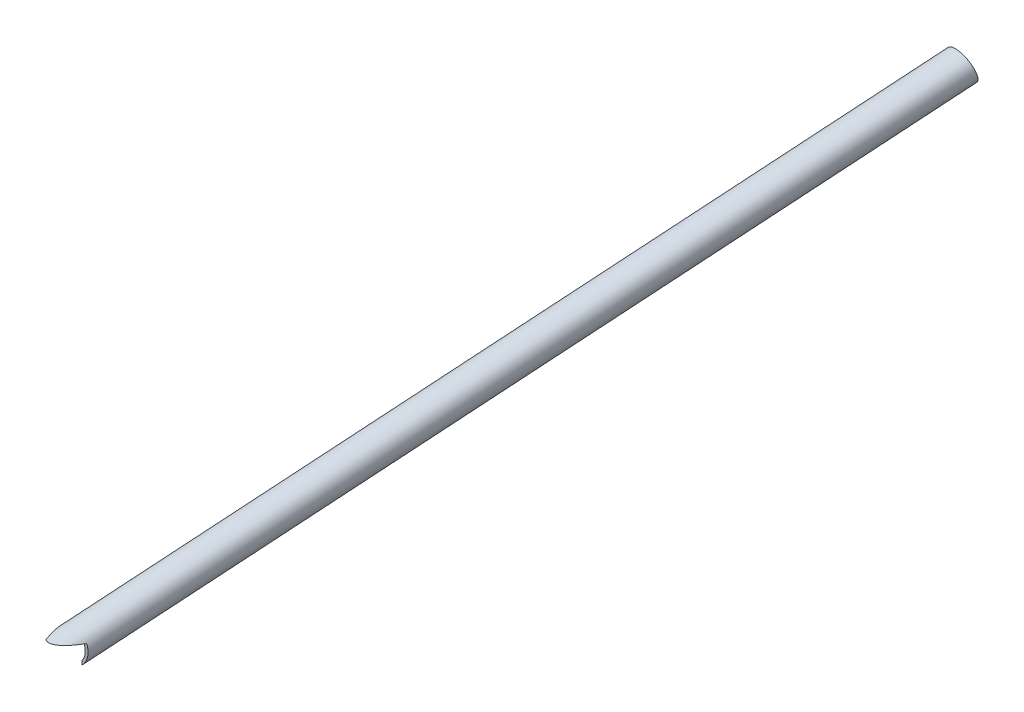
ISO-10303-21;
HEADER;
FILE_DESCRIPTION(('STEP AP214'),'2;1');
FILE_NAME('part.step','',(''),(''),'','','');
FILE_SCHEMA(('AUTOMOTIVE_DESIGN { 1 0 10303 214 1 1 1 1 }'));
ENDSEC;
DATA;
#1=APPLICATION_CONTEXT('core data for automotive mechanical design processes');
#2=APPLICATION_PROTOCOL_DEFINITION('international standard','automotive_design',2000,#1);
#3=PRODUCT_CONTEXT('',#1,'mechanical');
#4=PRODUCT('Part','Part','',(#3));
#5=PRODUCT_RELATED_PRODUCT_CATEGORY('part','',(#4));
#6=PRODUCT_DEFINITION_FORMATION('','',#4);
#7=PRODUCT_DEFINITION_CONTEXT('part definition',#1,'design');
#8=PRODUCT_DEFINITION('design','',#6,#7);
#9=PRODUCT_DEFINITION_SHAPE('','',#8);
#10=(LENGTH_UNIT() NAMED_UNIT(*) SI_UNIT(.MILLI.,.METRE.));
#11=(NAMED_UNIT(*) PLANE_ANGLE_UNIT() SI_UNIT($,.RADIAN.));
#12=(NAMED_UNIT(*) SI_UNIT($,.STERADIAN.) SOLID_ANGLE_UNIT());
#13=UNCERTAINTY_MEASURE_WITH_UNIT(LENGTH_MEASURE(1.E-05),#10,'distance_accuracy_value','');
#14=(GEOMETRIC_REPRESENTATION_CONTEXT(3) GLOBAL_UNCERTAINTY_ASSIGNED_CONTEXT((#13)) GLOBAL_UNIT_ASSIGNED_CONTEXT((#10,
#11,#12)) REPRESENTATION_CONTEXT('',''));
#15=CARTESIAN_POINT('',(0.,0.,0.));
#16=DIRECTION('',(0.,0.,1.));
#17=DIRECTION('',(1.,0.,0.));
#18=AXIS2_PLACEMENT_3D('',#15,#16,#17);
#19=CARTESIAN_POINT('',(-225.,200.,-200.));
#20=DIRECTION('',(0.313257210262409,0.388871019636094,-0.866400167535647));
#21=DIRECTION('',(0.,0.912318699307092,0.409480879766828));
#22=AXIS2_PLACEMENT_3D('',#19,#20,#21);
#23=CYLINDRICAL_SURFACE('',#22,7.9);
#24=CARTESIAN_POINT('',(-221.38438192881,204.488353467685,-210.));
#25=DIRECTION('',(0.,0.,1.));
#26=DIRECTION('',(0.627329537872645,0.778753909083283,0.));
#27=AXIS2_PLACEMENT_3D('',#24,#25,#26);
#28=ELLIPSE('',#27,9.11818844919022,7.9);
#29=CARTESIAN_POINT('',(-215.,199.831593159286,-210.));
#30=VERTEX_POINT('',#29);
#31=CARTESIAN_POINT('',(-214.223926995827,210.,-210.));
#32=VERTEX_POINT('',#31);
#33=EDGE_CURVE('E85',#30,#32,#28,.T.);
#34=ORIENTED_EDGE('',*,*,#33,.T.);
#35=CARTESIAN_POINT('',(-216.944444444444,210.,-222.279885200662));
#36=DIRECTION('',(0.,-1.,0.));
#37=DIRECTION('',(0.340019385805579,0.,-0.940418426699731));
#38=AXIS2_PLACEMENT_3D('',#35,#36,#37);
#39=ELLIPSE('',#38,20.3152191885958,7.9);
#40=CARTESIAN_POINT('',(-224.420881433489,210.,-203.449159749218));
#41=VERTEX_POINT('',#40);
#42=EDGE_CURVE('E56',#32,#41,#39,.T.);
#43=ORIENTED_EDGE('',*,*,#42,.T.);
#44=CARTESIAN_POINT('',(-223.15741407585,209.494665768298,-201.861286232762));
#45=CARTESIAN_POINT('',(-223.327974406081,209.562745738719,-202.012969265238));
#46=CARTESIAN_POINT('',(-223.488905143782,209.626944427415,-202.177273133401));
#47=CARTESIAN_POINT('',(-223.791864856838,209.748128840365,-202.525052642486));
#48=CARTESIAN_POINT('',(-223.933860733493,209.805101925764,-202.708560879474));
#49=CARTESIAN_POINT('',(-224.202084198849,209.912660789028,-203.090884440587));
#50=CARTESIAN_POINT('',(-224.328162850766,209.963186278447,-203.289819713301));
#51=CARTESIAN_POINT('',(-224.565793241595,210.057555962606,-203.69748136015));
#52=CARTESIAN_POINT('',(-224.677350123723,210.101402523783,-203.906204231962));
#53=CARTESIAN_POINT('',(-224.874517210087,210.17718743194,-204.302545574562));
#54=CARTESIAN_POINT('',(-224.961605595777,210.209933928598,-204.489284420905));
#55=CARTESIAN_POINT('',(-225.128243197558,210.270535558479,-204.866902084951));
#56=CARTESIAN_POINT('',(-225.207790896655,210.298389708443,-205.057781726225));
#57=CARTESIAN_POINT('',(-225.360531873015,210.349143618943,-205.442867432119));
#58=CARTESIAN_POINT('',(-225.433720346823,210.372039653504,-205.637075880848));
#59=CARTESIAN_POINT('',(-225.574605255814,210.412713683802,-206.028021785198));
#60=CARTESIAN_POINT('',(-225.642301057944,210.430491090198,-206.224759529311));
#61=CARTESIAN_POINT('',(-225.772850161109,210.460708569582,-206.620005490418));
#62=CARTESIAN_POINT('',(-225.83570849124,210.473154248712,-206.818511622635));
#63=CARTESIAN_POINT('',(-225.957233671713,210.492479216565,-207.217087974702));
#64=CARTESIAN_POINT('',(-226.01590016514,210.499358031809,-207.417158326132));
#65=CARTESIAN_POINT('',(-226.129437059783,210.507229691773,-207.818348290919));
#66=CARTESIAN_POINT('',(-226.184309936347,210.508226411098,-208.019467126207));
#67=CARTESIAN_POINT('',(-226.290629477458,210.503965117743,-208.422543713469));
#68=CARTESIAN_POINT('',(-226.342076037763,210.498706914856,-208.624501490768));
#69=CARTESIAN_POINT('',(-226.470812913115,210.476486415748,-209.146644744408));
#70=CARTESIAN_POINT('',(-226.545717299132,210.454493283931,-209.467228016283));
#71=CARTESIAN_POINT('',(-226.688135576776,210.391581478762,-210.108293160777));
#72=CARTESIAN_POINT('',(-226.755647653678,210.350658171095,-210.428774989327));
#73=CARTESIAN_POINT('',(-226.88318551129,210.24723608253,-211.066882200823));
#74=CARTESIAN_POINT('',(-226.943231403712,210.184797050782,-211.384513020717));
#75=CARTESIAN_POINT('',(-227.055662251596,210.034838645642,-212.015052089753));
#76=CARTESIAN_POINT('',(-227.108052412334,209.947336434132,-212.327963416731));
#77=CARTESIAN_POINT('',(-227.209205057179,209.732557526454,-212.976540123217));
#78=CARTESIAN_POINT('',(-227.257077223593,209.60217265415,-213.311341482179));
#79=CARTESIAN_POINT('',(-227.340526705393,209.298490783353,-213.96287870284));
#80=CARTESIAN_POINT('',(-227.376113972755,209.125228715901,-214.279629013145));
#81=CARTESIAN_POINT('',(-227.426142429048,208.769190109273,-214.819992523545));
#82=CARTESIAN_POINT('',(-227.443425831851,208.595680174492,-215.049371487169));
#83=CARTESIAN_POINT('',(-227.466260169275,208.21453962706,-215.478540418481));
#84=CARTESIAN_POINT('',(-227.471830524033,208.006966108684,-215.67837885174));
#85=CARTESIAN_POINT('',(-227.469678155462,207.59520199112,-216.008068509464));
#86=CARTESIAN_POINT('',(-227.463961777122,207.395905664675,-216.144012669458));
#87=CARTESIAN_POINT('',(-227.442562987403,206.978001992038,-216.38094169408));
#88=CARTESIAN_POINT('',(-227.426886380901,206.759405957675,-216.481946868424));
#89=CARTESIAN_POINT('',(-227.385919417368,206.309215765552,-216.645468005782));
#90=CARTESIAN_POINT('',(-227.360631160439,206.077624456615,-216.707992368865));
#91=CARTESIAN_POINT('',(-227.30157913635,205.608465167779,-216.79491824006));
#92=CARTESIAN_POINT('',(-227.267808448194,205.370892450642,-216.819288499405));
#93=CARTESIAN_POINT('',(-227.181282950598,204.819367462172,-216.835431093189));
#94=CARTESIAN_POINT('',(-227.125917576665,204.505476752567,-216.814165422459));
#95=CARTESIAN_POINT('',(-227.006237331831,203.886845601142,-216.722053584703));
#96=CARTESIAN_POINT('',(-226.941904338121,203.582125247281,-216.65110581589));
#97=CARTESIAN_POINT('',(-226.821041889938,203.049412135,-216.489738247));
#98=CARTESIAN_POINT('',(-226.765744490888,202.818835077272,-216.406622524923));
#99=CARTESIAN_POINT('',(-226.651774852837,202.36653896789,-216.220671171659));
#100=CARTESIAN_POINT('',(-226.593100571977,202.144825415872,-216.117823519814));
#101=CARTESIAN_POINT('',(-226.472751037479,201.710063822549,-215.895720879295));
#102=CARTESIAN_POINT('',(-226.411069469615,201.497035904644,-215.77643031513));
#103=CARTESIAN_POINT('',(-226.28504974538,201.079888985208,-215.524334572306));
#104=CARTESIAN_POINT('',(-226.220710623903,200.875773276549,-215.391524457837));
#105=CARTESIAN_POINT('',(-226.096880062015,200.498775780657,-215.130224660584));
#106=CARTESIAN_POINT('',(-226.037659740032,200.324966864671,-215.002935620688));
#107=CARTESIAN_POINT('',(-225.917163241838,199.983957879284,-214.740667265253));
#108=CARTESIAN_POINT('',(-225.855886743686,199.816758853822,-214.605686743108));
#109=CARTESIAN_POINT('',(-225.731130251101,199.48869541074,-214.328974776711));
#110=CARTESIAN_POINT('',(-225.667648744281,199.32783550917,-214.187238673058));
#111=CARTESIAN_POINT('',(-225.538320412779,199.012401106472,-213.897935161772));
#112=CARTESIAN_POINT('',(-225.472473273086,198.857827448312,-213.75036697727));
#113=CARTESIAN_POINT('',(-225.338141714108,198.554888492325,-213.450141487032));
#114=CARTESIAN_POINT('',(-225.269657204778,198.406523406829,-213.297484007564));
#115=CARTESIAN_POINT('',(-225.129686954206,198.115998592107,-212.987741281181));
#116=CARTESIAN_POINT('',(-225.058201525117,197.973838220595,-212.830656495346));
#117=CARTESIAN_POINT('',(-224.911778713593,197.69585221722,-212.51271795481));
#118=CARTESIAN_POINT('',(-224.83684334535,197.560022979961,-212.351866425553));
#119=CARTESIAN_POINT('',(-224.682866587882,197.294805557343,-212.026877908535));
#120=CARTESIAN_POINT('',(-224.603825600433,197.165416744144,-211.86274124322));
#121=CARTESIAN_POINT('',(-224.436786061511,196.907129602943,-211.523498171585));
#122=CARTESIAN_POINT('',(-224.348537543981,196.778575417703,-211.348252067001));
#123=CARTESIAN_POINT('',(-224.16548454257,196.529560758505,-210.995483522681));
#124=CARTESIAN_POINT('',(-224.070681338234,196.409098713877,-210.817961532701));
#125=CARTESIAN_POINT('',(-223.873085464908,196.177293680949,-210.461571387701));
#126=CARTESIAN_POINT('',(-223.770297792094,196.065945078209,-210.282704136752));
#127=CARTESIAN_POINT('',(-223.554863184148,195.853772251428,-209.924640484168));
#128=CARTESIAN_POINT('',(-223.442218498163,195.75294563796,-209.745444166708));
#129=CARTESIAN_POINT('',(-223.234626401174,195.587660603326,-209.432985571822));
#130=CARTESIAN_POINT('',(-223.142308980556,195.520416901981,-209.299455405871));
#131=CARTESIAN_POINT('',(-222.949943619698,195.3943239469,-209.033943945667));
#132=CARTESIAN_POINT('',(-222.849895474166,195.335474916206,-208.901962692652));
#133=CARTESIAN_POINT('',(-222.641443975574,195.227862081538,-208.640995227644));
#134=CARTESIAN_POINT('',(-222.533060294658,195.179075475351,-208.512002845316));
#135=CARTESIAN_POINT('',(-222.307186863993,195.093255768318,-208.258126637429));
#136=CARTESIAN_POINT('',(-222.189700347237,195.056218518124,-208.133241375415));
#137=CARTESIAN_POINT('',(-221.971439645239,195.00217499722,-207.914922414697));
#138=CARTESIAN_POINT('',(-221.872375764756,194.982590324942,-207.820416326994));
#139=CARTESIAN_POINT('',(-221.669003103014,194.95275595388,-207.63568451151));
#140=CARTESIAN_POINT('',(-221.564695576393,194.942504033175,-207.545457769765));
#141=CARTESIAN_POINT('',(-221.351608787198,194.931970535455,-207.369936486675));
#142=CARTESIAN_POINT('',(-221.242831854887,194.931683827186,-207.284639429545));
#143=CARTESIAN_POINT('',(-221.021788289261,194.941400110647,-207.119309538873));
#144=CARTESIAN_POINT('',(-220.909521510799,194.95140353091,-207.039276924717));
#145=CARTESIAN_POINT('',(-220.6830512334,194.981651985541,-206.884793232691));
#146=CARTESIAN_POINT('',(-220.568854297071,195.001867227309,-206.810326637569));
#147=CARTESIAN_POINT('',(-220.33944988945,195.052223836628,-206.666513379757));
#148=CARTESIAN_POINT('',(-220.224242412262,195.082365262108,-206.597166746949));
#149=CARTESIAN_POINT('',(-219.993790923522,195.152124881837,-206.463048150085));
#150=CARTESIAN_POINT('',(-219.878547146444,195.191758105129,-206.398283654075));
#151=CARTESIAN_POINT('',(-219.649197891393,195.279864179177,-206.272854501397));
#152=CARTESIAN_POINT('',(-219.535092738681,195.328339483602,-206.212190989169));
#153=CARTESIAN_POINT('',(-219.257576496114,195.45733302977,-206.067585253041));
#154=CARTESIAN_POINT('',(-219.095274118385,195.542412800202,-205.985563401102));
#155=CARTESIAN_POINT('',(-218.776971131236,195.727974790129,-205.826860147979));
#156=CARTESIAN_POINT('',(-218.62097313416,195.828463313507,-205.750180951291));
#157=CARTESIAN_POINT('',(-218.316732659703,196.043239005077,-205.600369678967));
#158=CARTESIAN_POINT('',(-218.16849809937,196.157539880749,-205.527241229669));
#159=CARTESIAN_POINT('',(-217.88120493768,196.398398310811,-205.383169131196));
#160=CARTESIAN_POINT('',(-217.74214728319,196.524957126654,-205.312225707872));
#161=CARTESIAN_POINT('',(-217.47104442082,196.792238551892,-205.16967914951));
#162=CARTESIAN_POINT('',(-217.339251014933,196.933230194536,-205.098101730693));
#163=CARTESIAN_POINT('',(-217.087462372493,197.225459863601,-204.955111214979));
#164=CARTESIAN_POINT('',(-216.96746732582,197.376698054862,-204.883698120746));
#165=CARTESIAN_POINT('',(-216.740269714125,197.688188770665,-204.740379001976));
#166=CARTESIAN_POINT('',(-216.633062683641,197.848438119659,-204.668473158831));
#167=CARTESIAN_POINT('',(-216.432287564363,198.176839087152,-204.52368241459));
#168=CARTESIAN_POINT('',(-216.338719270829,198.344990586977,-204.450797528208));
#169=CARTESIAN_POINT('',(-216.15677793221,198.706456120529,-204.295872811039));
#170=CARTESIAN_POINT('',(-216.070038623281,198.900534546056,-204.213689544825));
#171=CARTESIAN_POINT('',(-215.91530453798,199.295348441644,-204.047626407179));
#172=CARTESIAN_POINT('',(-215.847311173235,199.496084411764,-203.96374640849));
#173=CARTESIAN_POINT('',(-215.73093226559,199.902515605059,-203.794368539942));
#174=CARTESIAN_POINT('',(-215.68254733055,200.108210981766,-203.708870620013));
#175=CARTESIAN_POINT('',(-215.606060390176,200.522782468831,-203.536536081388));
#176=CARTESIAN_POINT('',(-215.577957033119,200.731658366268,-203.449699552299));
#177=CARTESIAN_POINT('',(-215.543340986324,201.140432778623,-203.279445596998));
#178=CARTESIAN_POINT('',(-215.535830449981,201.340265136831,-203.196071138344));
#179=CARTESIAN_POINT('',(-215.539682946782,201.739620866271,-203.029022125265));
#180=CARTESIAN_POINT('',(-215.551045424227,201.939144246428,-202.945347579748));
#181=CARTESIAN_POINT('',(-215.592573327759,202.336318709402,-202.778326520772));
#182=CARTESIAN_POINT('',(-215.622735400207,202.533970119777,-202.694979951473));
#183=CARTESIAN_POINT('',(-215.701568806861,202.925976046155,-202.52930186635));
#184=CARTESIAN_POINT('',(-215.750239943658,203.120330597299,-202.446970339708));
#185=CARTESIAN_POINT('',(-215.863804572901,203.498450989392,-202.286616489956));
#186=CARTESIAN_POINT('',(-215.928150775407,203.682358483185,-202.208539605135));
#187=CARTESIAN_POINT('',(-216.073123953725,204.044687230108,-202.054835978458));
#188=CARTESIAN_POINT('',(-216.153750491643,204.22310863065,-201.979209170764));
#189=CARTESIAN_POINT('',(-216.330501234904,204.573463596593,-201.831238489228));
#190=CARTESIAN_POINT('',(-216.426622495393,204.745398387162,-201.758893994906));
#191=CARTESIAN_POINT('',(-216.633496436453,205.082004151424,-201.618350883463));
#192=CARTESIAN_POINT('',(-216.744249564942,205.24667490254,-201.550152393356));
#193=CARTESIAN_POINT('',(-216.983229903198,205.573297796004,-201.416731456826));
#194=CARTESIAN_POINT('',(-217.111906561118,205.734989572437,-201.351676704889));
#195=CARTESIAN_POINT('',(-217.382694169539,206.049393476438,-201.228166234611));
#196=CARTESIAN_POINT('',(-217.524805521934,206.202105335152,-201.169710713798));
#197=CARTESIAN_POINT('',(-217.821544173805,206.498468127981,-201.060620550981));
#198=CARTESIAN_POINT('',(-217.976194403956,206.642101565819,-201.010000753731));
#199=CARTESIAN_POINT('',(-218.296505872166,206.919812650993,-200.918270585675));
#200=CARTESIAN_POINT('',(-218.462167187964,207.053890230851,-200.877160282017));
#201=CARTESIAN_POINT('',(-218.812470927997,207.319564559755,-200.80436821664));
#202=CARTESIAN_POINT('',(-218.997655997851,207.450623371203,-200.773326065643));
#203=CARTESIAN_POINT('',(-219.376959822802,207.702310836853,-200.726558291976));
#204=CARTESIAN_POINT('',(-219.571081158671,207.822936448648,-200.7108371234));
#205=CARTESIAN_POINT('',(-219.965281186633,208.053700174132,-200.698013095304));
#206=CARTESIAN_POINT('',(-220.165338920173,208.163870487333,-200.700851056921));
#207=CARTESIAN_POINT('',(-220.568888598542,208.374584569381,-200.728813702705));
#208=CARTESIAN_POINT('',(-220.772377324186,208.475136829215,-200.753918524323));
#209=CARTESIAN_POINT('',(-221.101022026062,208.630498293655,-200.81565692272));
#210=CARTESIAN_POINT('',(-221.226399658319,208.688105308887,-200.844220107541));
#211=CARTESIAN_POINT('',(-221.475700205107,208.800011237156,-200.912080050721));
#212=CARTESIAN_POINT('',(-221.599623613149,208.854311300299,-200.951373051044));
#213=CARTESIAN_POINT('',(-221.844522313545,208.959647336043,-201.041131092977));
#214=CARTESIAN_POINT('',(-221.96550224301,209.010688680509,-201.091577102569));
#215=CARTESIAN_POINT('',(-222.2033673188,209.109701585334,-201.203766435686));
#216=CARTESIAN_POINT('',(-222.320253655822,209.157674041749,-201.265506441073));
#217=CARTESIAN_POINT('',(-222.562396763166,209.256210635006,-201.407957815532));
#218=CARTESIAN_POINT('',(-222.686993571194,209.306403473372,-201.49005265607));
#219=CARTESIAN_POINT('',(-222.928256144755,209.403179938807,-201.666705170069));
#220=CARTESIAN_POINT('',(-223.044929269012,209.449766920412,-201.761251033571));
#221=CARTESIAN_POINT('',(-223.15741407585,209.494665768298,-201.861286232762));
#222=B_SPLINE_CURVE_WITH_KNOTS('',3,(#44,#45,#46,#47,#48,#49,#50,#51,#52,#53,#54,#55,#56,#57,
#58,#59,#60,#61,#62,#63,#64,#65,#66,#67,#68,#69,#70,#71,#72,#73,#74,#75,#76,#77,#78,#79,#80,#81,
#82,#83,#84,#85,#86,#87,#88,#89,#90,#91,#92,#93,#94,#95,#96,#97,#98,#99,#100,#101,#102,#103,
#104,#105,#106,#107,#108,#109,#110,#111,#112,#113,#114,#115,#116,#117,#118,#119,#120,#121,#122,
#123,#124,#125,#126,#127,#128,#129,#130,#131,#132,#133,#134,#135,#136,#137,#138,#139,#140,#141,
#142,#143,#144,#145,#146,#147,#148,#149,#150,#151,#152,#153,#154,#155,#156,#157,#158,#159,#160,
#161,#162,#163,#164,#165,#166,#167,#168,#169,#170,#171,#172,#173,#174,#175,#176,#177,#178,#179,
#180,#181,#182,#183,#184,#185,#186,#187,#188,#189,#190,#191,#192,#193,#194,#195,#196,#197,#198,
#199,#200,#201,#202,#203,#204,#205,#206,#207,#208,#209,#210,#211,#212,#213,#214,#215,#216,#217,
#218,#219,#220,#221),.UNSPECIFIED.,.T.,.F.,(4,2,2,2,2,2,2,2,2,2,2,2,2,2,2,2,2,2,2,2,2,2,2,2,2,2,
2,2,2,2,2,2,2,2,2,2,2,2,2,2,2,2,2,2,2,2,2,2,2,2,2,2,2,2,2,2,2,2,2,2,2,2,2,2,2,2,2,2,2,2,2,2,2,2,
2,2,2,2,2,2,2,2,2,2,2,2,2,2,4),(0.,0.714245117726573,1.42972283287109,2.15146461168768,
2.87295006959618,3.49859524560433,4.1243660195278,4.75060543445313,5.3769169236506,
6.00256824013806,6.62827276458413,7.25356508423231,7.87887641897234,8.86813382212591,
9.85763353455124,10.8444072608657,11.8305069076751,12.9154713279562,13.9995547464467,
14.8609331626713,15.7208822908646,16.441590415181,17.1618788915938,17.8820100786791,
18.6027307557254,19.5557423548171,20.5107086123734,21.2634662633576,22.0166839576083,
22.7715576512426,23.5267079344595,24.1967322720759,24.8668620112127,25.5374608305526,
26.2081492808805,26.878860649909,27.5495024241158,28.219757500887,28.8899471098575,
29.5934533549847,30.2968226538392,30.9997553201661,31.7025280093611,32.2293527735405,
32.7561915325005,33.2818229904587,33.807268611714,34.2217495148687,34.6361317135871,
35.050300536893,35.4644866089927,35.8774712282364,36.2904582577541,36.7041035735799,
37.1178638507467,37.7192784026032,38.3209396592193,38.9232029895981,39.5255283642996,
40.1424590597957,40.759399682459,41.3761242402762,41.9928395390149,42.675704158789,
43.3586201863739,44.0415573826624,44.7244490584874,45.3736113319637,46.0227544918241,
46.6717818849356,47.3208023560707,47.9497833687385,48.5787474658448,49.2075921656434,
49.8364561204639,50.48566792798,51.1348991626085,51.7853456949973,52.4357968200243,
53.1218679578884,53.8081384899494,54.4922218040395,55.1756955131246,55.5980152450934,
56.0201872520848,56.4416443303447,56.8629777841833,57.3344676018774,57.8055133837074),.UNSPECIFIED.);
#223=CARTESIAN_POINT('',(-227.0734472286,210.,-212.126605746777));
#224=VERTEX_POINT('',#223);
#225=EDGE_CURVE('E105',#41,#224,#222,.T.);
#226=ORIENTED_EDGE('',*,*,#225,.T.);
#227=CARTESIAN_POINT('',(-215.,210.,-239.923532285982));
#228=VERTEX_POINT('',#227);
#229=EDGE_CURVE('E94',#224,#228,#39,.T.);
#230=ORIENTED_EDGE('',*,*,#229,.T.);
#231=CARTESIAN_POINT('',(-215.,212.413793103448,-227.657788524959));
#232=DIRECTION('',(-1.,0.,0.));
#233=DIRECTION('',(0.,0.409480879766828,-0.912318699307092));
#234=AXIS2_PLACEMENT_3D('',#231,#232,#233);
#235=ELLIPSE('',#234,25.2188927858431,7.9);
#236=EDGE_CURVE('E104',#228,#30,#235,.T.);
#237=ORIENTED_EDGE('',*,*,#236,.T.);
#238=EDGE_LOOP('',(#34,#43,#226,#230,#237));
#239=FACE_BOUND('',#238,.T.);
#240=CARTESIAN_POINT('',(-79.9999999999999,380.,-601.037933611912));
#241=DIRECTION('',(0.0966021654991003,0.31145037677638,-0.945339454601751));
#242=DIRECTION('',(0.909209641489906,0.358833563956318,0.211131004829239));
#243=AXIS2_PLACEMENT_3D('',#240,#241,#242);
#244=ELLIPSE('',#243,8.14082504262806,7.9);
#245=CARTESIAN_POINT('',(-72.59828338156,382.921201263591,-599.319153040523));
#246=VERTEX_POINT('',#245);
#247=EDGE_CURVE('E43',#246,#246,#244,.T.);
#248=ORIENTED_EDGE('',*,*,#247,.T.);
#249=EDGE_LOOP('',(#248));
#250=FACE_BOUND('',#249,.T.);
#251=ADVANCED_FACE('F39',(#239,#250),#23,.F.);
#252=CARTESIAN_POINT('',(-225.,200.,-200.));
#253=DIRECTION('',(0.313257210262409,0.388871019636094,-0.866400167535647));
#254=DIRECTION('',(0.,0.912318699307092,0.409480879766828));
#255=AXIS2_PLACEMENT_3D('',#252,#253,#254);
#256=CYLINDRICAL_SURFACE('',#255,9.5);
#257=CARTESIAN_POINT('',(-216.944444444444,210.,-222.279885200662));
#258=DIRECTION('',(0.,-1.,0.));
#259=DIRECTION('',(0.340019385805579,0.,-0.940418426699731));
#260=AXIS2_PLACEMENT_3D('',#257,#258,#259);
#261=ELLIPSE('',#260,24.4296939609696,9.5);
#262=CARTESIAN_POINT('',(-212.152625115666,210.,-210.));
#263=VERTEX_POINT('',#262);
#264=CARTESIAN_POINT('',(-226.408415127519,210.,-199.974629586691));
#265=VERTEX_POINT('',#264);
#266=EDGE_CURVE('E48',#263,#265,#261,.T.);
#267=ORIENTED_EDGE('',*,*,#266,.F.);
#268=CARTESIAN_POINT('',(-221.38438192881,204.488353467685,-210.));
#269=DIRECTION('',(0.,0.,1.));
#270=DIRECTION('',(0.627329537872645,0.778753909083283,0.));
#271=AXIS2_PLACEMENT_3D('',#268,#269,#270);
#272=ELLIPSE('',#271,10.9649101604186,9.5);
#273=CARTESIAN_POINT('',(-215.,197.413463504428,-210.));
#274=VERTEX_POINT('',#273);
#275=EDGE_CURVE('E81',#274,#263,#272,.T.);
#276=ORIENTED_EDGE('',*,*,#275,.F.);
#277=CARTESIAN_POINT('',(-215.,212.413793103448,-227.657788524959));
#278=DIRECTION('',(-1.,0.,0.));
#279=DIRECTION('',(0.,0.409480879766828,-0.912318699307092));
#280=AXIS2_PLACEMENT_3D('',#277,#278,#279);
#281=ELLIPSE('',#280,30.3265166412037,9.5);
#282=CARTESIAN_POINT('',(-215.,210.,-243.177807236862));
#283=VERTEX_POINT('',#282);
#284=EDGE_CURVE('E168',#283,#274,#281,.T.);
#285=ORIENTED_EDGE('',*,*,#284,.F.);
#286=CARTESIAN_POINT('',(-228.616604705313,210.,-215.105762164605));
#287=VERTEX_POINT('',#286);
#288=EDGE_CURVE('E165',#287,#283,#261,.T.);
#289=ORIENTED_EDGE('',*,*,#288,.F.);
#290=CARTESIAN_POINT('',(-225.,200.,-200.));
#291=DIRECTION('',(0.979997411230481,0.1383871597552,-0.143017719169493));
#292=DIRECTION('',(-0.18494238420669,0.367901037751926,-0.911287627999525));
#293=AXIS2_PLACEMENT_3D('',#290,#291,#292);
#294=ELLIPSE('',#293,19.5990817258114,9.5);
#295=EDGE_CURVE('E112',#265,#287,#294,.F.);
#296=ORIENTED_EDGE('',*,*,#295,.F.);
#297=EDGE_LOOP('',(#267,#276,#285,#289,#296));
#298=FACE_BOUND('',#297,.T.);
#299=CARTESIAN_POINT('',(-79.9999999999999,380.,-601.037933611912));
#300=DIRECTION('',(0.0966021654991003,0.31145037677638,-0.945339454601751));
#301=DIRECTION('',(0.909209641489906,0.358833563956318,0.211131004829239));
#302=AXIS2_PLACEMENT_3D('',#299,#300,#301);
#303=ELLIPSE('',#302,9.78959973480588,9.5);
#304=CARTESIAN_POINT('',(-71.0992015347873,383.512836962546,-598.971045583026));
#305=VERTEX_POINT('',#304);
#306=EDGE_CURVE('E11',#305,#305,#303,.T.);
#307=ORIENTED_EDGE('',*,*,#306,.F.);
#308=EDGE_LOOP('',(#307));
#309=FACE_BOUND('',#308,.T.);
#310=ADVANCED_FACE('F130',(#298,#309),#256,.T.);
#311=CARTESIAN_POINT('',(-225.,200.,-200.));
#312=DIRECTION('',(0.636784790371592,-0.254713916148637,0.727754046138963));
#313=DIRECTION('',(0.752576694706878,0.,-0.658504607868518));
#314=AXIS2_PLACEMENT_3D('',#311,#312,#313);
#315=CYLINDRICAL_SURFACE('',#314,9.5);
#316=ORIENTED_EDGE('',*,*,#295,.T.);
#317=CARTESIAN_POINT('',(-250.,210.,-228.571428571429));
#318=DIRECTION('',(0.,-1.,0.));
#319=DIRECTION('',(0.658504607868518,0.,0.752576694706878));
#320=AXIS2_PLACEMENT_3D('',#317,#318,#319);
#321=ELLIPSE('',#320,37.2967450842235,9.5);
#322=EDGE_CURVE('E97',#287,#224,#321,.T.);
#323=ORIENTED_EDGE('',*,*,#322,.T.);
#324=ORIENTED_EDGE('',*,*,#225,.F.);
#325=EDGE_CURVE('E62',#41,#265,#321,.T.);
#326=ORIENTED_EDGE('',*,*,#325,.T.);
#327=EDGE_LOOP('',(#316,#323,#324,#326));
#328=FACE_BOUND('',#327,.T.);
#329=ADVANCED_FACE('F110',(#328),#315,.F.);
#330=CARTESIAN_POINT('',(-225.,190.,-210.));
#331=DIRECTION('',(0.,0.,1.));
#332=DIRECTION('',(1.,0.,0.));
#333=AXIS2_PLACEMENT_3D('',#330,#331,#332);
#334=PLANE('',#333);
#335=DIRECTION('',(0.,-1.,0.));
#336=VECTOR('',#335,1.);
#337=CARTESIAN_POINT('',(-215.,190.,-210.));
#338=LINE('',#337,#336);
#339=EDGE_CURVE('E167',#30,#274,#338,.T.);
#340=ORIENTED_EDGE('',*,*,#339,.T.);
#341=ORIENTED_EDGE('',*,*,#275,.T.);
#342=DIRECTION('',(1.,0.,0.));
#343=VECTOR('',#342,1.);
#344=CARTESIAN_POINT('',(-225.,210.,-210.));
#345=LINE('',#344,#343);
#346=EDGE_CURVE('E164',#32,#263,#345,.T.);
#347=ORIENTED_EDGE('',*,*,#346,.F.);
#348=ORIENTED_EDGE('',*,*,#33,.F.);
#349=EDGE_LOOP('',(#340,#341,#347,#348));
#350=FACE_BOUND('',#349,.T.);
#351=ADVANCED_FACE('F129',(#350),#334,.T.);
#352=CARTESIAN_POINT('',(-215.,190.,-450.));
#353=DIRECTION('',(-1.,0.,0.));
#354=DIRECTION('',(0.,0.,1.));
#355=AXIS2_PLACEMENT_3D('',#352,#353,#354);
#356=PLANE('',#355);
#357=DIRECTION('',(0.,0.,1.));
#358=VECTOR('',#357,1.);
#359=CARTESIAN_POINT('',(-215.,210.,-450.));
#360=LINE('',#359,#358);
#361=EDGE_CURVE('E100',#283,#228,#360,.T.);
#362=ORIENTED_EDGE('',*,*,#361,.F.);
#363=ORIENTED_EDGE('',*,*,#284,.T.);
#364=ORIENTED_EDGE('',*,*,#339,.F.);
#365=ORIENTED_EDGE('',*,*,#236,.F.);
#366=EDGE_LOOP('',(#362,#363,#364,#365));
#367=FACE_BOUND('',#366,.T.);
#368=ADVANCED_FACE('F133',(#367),#356,.T.);
#369=CARTESIAN_POINT('',(-225.,210.,-190.));
#370=DIRECTION('',(0.,-1.,0.));
#371=DIRECTION('',(0.,0.,-1.));
#372=AXIS2_PLACEMENT_3D('',#369,#370,#371);
#373=PLANE('',#372);
#374=ORIENTED_EDGE('',*,*,#322,.F.);
#375=ORIENTED_EDGE('',*,*,#288,.T.);
#376=ORIENTED_EDGE('',*,*,#361,.T.);
#377=ORIENTED_EDGE('',*,*,#229,.F.);
#378=EDGE_LOOP('',(#374,#375,#376,#377));
#379=FACE_BOUND('',#378,.T.);
#380=ADVANCED_FACE('F96',(#379),#373,.T.);
#381=ORIENTED_EDGE('',*,*,#346,.T.);
#382=ORIENTED_EDGE('',*,*,#266,.T.);
#383=ORIENTED_EDGE('',*,*,#325,.F.);
#384=ORIENTED_EDGE('',*,*,#42,.F.);
#385=EDGE_LOOP('',(#381,#382,#383,#384));
#386=FACE_BOUND('',#385,.T.);
#387=ADVANCED_FACE('F134',(#386),#373,.T.);
#388=CARTESIAN_POINT('',(-80.,380.,-601.037933611912));
#389=DIRECTION('',(0.0966021654991003,0.31145037677638,-0.945339454601751));
#390=DIRECTION('',(0.,0.949781512459289,0.312913851707695));
#391=AXIS2_PLACEMENT_3D('',#388,#389,#390);
#392=PLANE('',#391);
#393=ORIENTED_EDGE('',*,*,#247,.F.);
#394=EDGE_LOOP('',(#393));
#395=FACE_BOUND('',#394,.T.);
#396=ORIENTED_EDGE('',*,*,#306,.T.);
#397=EDGE_LOOP('',(#396));
#398=FACE_BOUND('',#397,.T.);
#399=ADVANCED_FACE('F41',(#395,#398),#392,.T.);
#400=CLOSED_SHELL('',(#251,#310,#329,#351,#368,#380,#387,#399));
#401=MANIFOLD_SOLID_BREP('B2',#400);
#402=ADVANCED_BREP_SHAPE_REPRESENTATION('',(#18,#401),#14);
#403=SHAPE_DEFINITION_REPRESENTATION(#9,#402);
ENDSEC;
END-ISO-10303-21;
